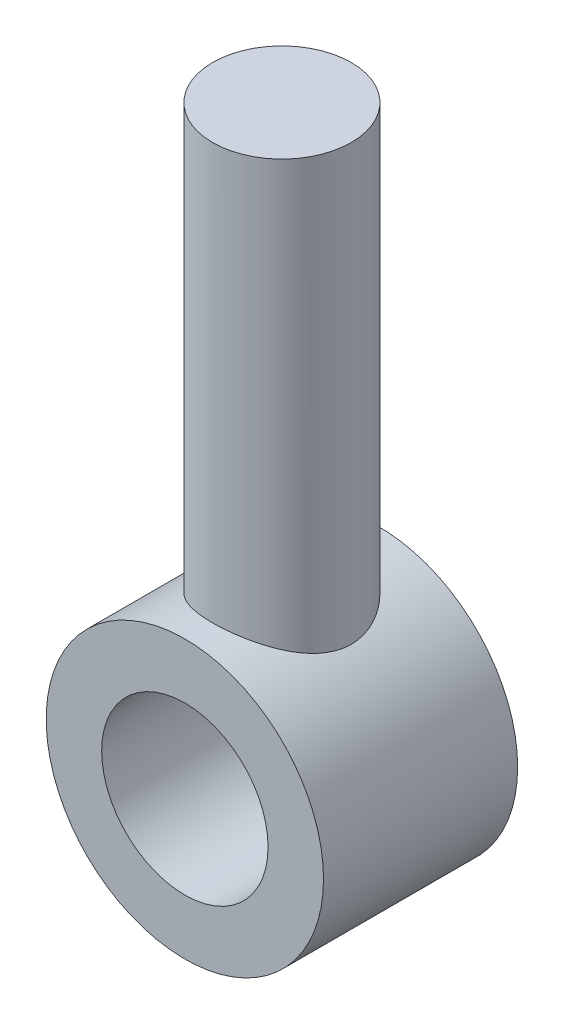
ISO-10303-21;
HEADER;
FILE_DESCRIPTION(('STEP AP214'),'2;1');
FILE_NAME('part.step','',(''),(''),'','','');
FILE_SCHEMA(('AUTOMOTIVE_DESIGN { 1 0 10303 214 1 1 1 1 }'));
ENDSEC;
DATA;
#1=APPLICATION_CONTEXT('core data for automotive mechanical design processes');
#2=APPLICATION_PROTOCOL_DEFINITION('international standard','automotive_design',2000,#1);
#3=PRODUCT_CONTEXT('',#1,'mechanical');
#4=PRODUCT('Part','Part','',(#3));
#5=PRODUCT_RELATED_PRODUCT_CATEGORY('part','',(#4));
#6=PRODUCT_DEFINITION_FORMATION('','',#4);
#7=PRODUCT_DEFINITION_CONTEXT('part definition',#1,'design');
#8=PRODUCT_DEFINITION('design','',#6,#7);
#9=PRODUCT_DEFINITION_SHAPE('','',#8);
#10=(LENGTH_UNIT() NAMED_UNIT(*) SI_UNIT(.MILLI.,.METRE.));
#11=(NAMED_UNIT(*) PLANE_ANGLE_UNIT() SI_UNIT($,.RADIAN.));
#12=(NAMED_UNIT(*) SI_UNIT($,.STERADIAN.) SOLID_ANGLE_UNIT());
#13=UNCERTAINTY_MEASURE_WITH_UNIT(LENGTH_MEASURE(1.E-05),#10,'distance_accuracy_value','');
#14=(GEOMETRIC_REPRESENTATION_CONTEXT(3) GLOBAL_UNCERTAINTY_ASSIGNED_CONTEXT((#13)) GLOBAL_UNIT_ASSIGNED_CONTEXT((#10,
#11,#12)) REPRESENTATION_CONTEXT('',''));
#15=CARTESIAN_POINT('',(0.,0.,0.));
#16=DIRECTION('',(0.,0.,1.));
#17=DIRECTION('',(1.,0.,0.));
#18=AXIS2_PLACEMENT_3D('',#15,#16,#17);
#19=CARTESIAN_POINT('',(0.,0.,7.));
#20=DIRECTION('',(0.,0.,-1.));
#21=DIRECTION('',(-1.,0.,0.));
#22=AXIS2_PLACEMENT_3D('',#19,#20,#21);
#23=CYLINDRICAL_SURFACE('',#22,5.);
#24=CARTESIAN_POINT('',(0.,0.,7.));
#25=DIRECTION('',(0.,0.,1.));
#26=DIRECTION('',(1.,0.,0.));
#27=AXIS2_PLACEMENT_3D('',#24,#25,#26);
#28=CIRCLE('',#27,5.);
#29=CARTESIAN_POINT('',(5.,0.,7.));
#30=VERTEX_POINT('',#29);
#31=EDGE_CURVE('E48',#30,#30,#28,.T.);
#32=ORIENTED_EDGE('',*,*,#31,.F.);
#33=EDGE_LOOP('',(#32));
#34=FACE_BOUND('',#33,.T.);
#35=CARTESIAN_POINT('',(0.,0.,0.));
#36=DIRECTION('',(0.,0.,1.));
#37=DIRECTION('',(1.,0.,0.));
#38=AXIS2_PLACEMENT_3D('',#35,#36,#37);
#39=CIRCLE('',#38,5.);
#40=CARTESIAN_POINT('',(5.,0.,0.));
#41=VERTEX_POINT('',#40);
#42=EDGE_CURVE('E44',#41,#41,#39,.T.);
#43=ORIENTED_EDGE('',*,*,#42,.T.);
#44=EDGE_LOOP('',(#43));
#45=FACE_BOUND('',#44,.T.);
#46=CARTESIAN_POINT('',(0.,5.,1.));
#47=CARTESIAN_POINT('',(-0.131426682334305,4.99999177550472,1.00000966905601));
#48=CARTESIAN_POINT('',(-0.263015634437212,4.99476199135277,1.01042556177403));
#49=CARTESIAN_POINT('',(-0.522301454622882,4.9743541856102,1.05163182116205));
#50=CARTESIAN_POINT('',(-0.649990448564105,4.9591572718767,1.08246088092502));
#51=CARTESIAN_POINT('',(-0.897333631316203,4.92040690922477,1.16298462271884));
#52=CARTESIAN_POINT('',(-1.01701694536277,4.89688595907259,1.21260598778273));
#53=CARTESIAN_POINT('',(-1.24618160399671,4.84364443325827,1.3289265262518));
#54=CARTESIAN_POINT('',(-1.3556637520377,4.81392434644421,1.39562435314509));
#55=CARTESIAN_POINT('',(-1.56876952630998,4.74890645050632,1.54879313164263));
#56=CARTESIAN_POINT('',(-1.67163802294308,4.71337997659091,1.63621620022978));
#57=CARTESIAN_POINT('',(-1.86194861703333,4.64149925776731,1.82630369598529));
#58=CARTESIAN_POINT('',(-1.94937895911555,4.60514440566897,1.92897962884011));
#59=CARTESIAN_POINT('',(-2.11312999967247,4.53247377945621,2.15620837444528));
#60=CARTESIAN_POINT('',(-2.18806333849064,4.49637967412567,2.28184024603501));
#61=CARTESIAN_POINT('',(-2.31542056761491,4.43214946943555,2.54591833979543));
#62=CARTESIAN_POINT('',(-2.36786053751682,4.40400769020792,2.68435532176262));
#63=CARTESIAN_POINT('',(-2.44533110537653,4.36144667591402,2.96166276359641));
#64=CARTESIAN_POINT('',(-2.47181464267578,4.34630678958452,3.10001113017958));
#65=CARTESIAN_POINT('',(-2.50106748329741,4.3295472487215,3.37994709443761));
#66=CARTESIAN_POINT('',(-2.50386022093906,4.3279142335843,3.52153135217509));
#67=CARTESIAN_POINT('',(-2.48671821792512,4.33777325642937,3.78571506079088));
#68=CARTESIAN_POINT('',(-2.46946139884055,4.34771909154984,3.90856007805828));
#69=CARTESIAN_POINT('',(-2.41734962264384,4.37690571834675,4.14930477343195));
#70=CARTESIAN_POINT('',(-2.38248905974454,4.39614947079454,4.26720286326311));
#71=CARTESIAN_POINT('',(-2.29552445096459,4.44218691031839,4.49807283141433));
#72=CARTESIAN_POINT('',(-2.24303766778987,4.46914601659992,4.61086599696452));
#73=CARTESIAN_POINT('',(-2.12260421917012,4.52758510703513,4.82658573147497));
#74=CARTESIAN_POINT('',(-2.0546506095312,4.55906711950477,4.92950783900021));
#75=CARTESIAN_POINT('',(-1.89516513728194,4.62782894758213,5.13630313185808));
#76=CARTESIAN_POINT('',(-1.8017361459232,4.66533775591865,5.2386421839404));
#77=CARTESIAN_POINT('',(-1.59888894685344,4.73869058251019,5.42683854647725));
#78=CARTESIAN_POINT('',(-1.48946314143571,4.77453379897003,5.5126879800847));
#79=CARTESIAN_POINT('',(-1.25129126457962,4.84254968207409,5.66921415257432));
#80=CARTESIAN_POINT('',(-1.12188397899853,4.87447460405015,5.73900118111435));
#81=CARTESIAN_POINT('',(-0.851165538721987,4.92894702803108,5.85524257260752));
#82=CARTESIAN_POINT('',(-0.709863940663164,4.95150197358893,5.9017154625379));
#83=CARTESIAN_POINT('',(-0.431916229151782,4.98310834353579,5.9661885092917));
#84=CARTESIAN_POINT('',(-0.295853826370908,4.9931234575324,5.986228089367));
#85=CARTESIAN_POINT('',(-0.0219489998732899,5.00182533647794,6.00366182783617));
#86=CARTESIAN_POINT('',(0.115892549675108,5.00051746803426,6.0010667140985));
#87=CARTESIAN_POINT('',(0.378082429964655,4.98727980633468,5.9744832789533));
#88=CARTESIAN_POINT('',(0.502648520123705,4.97618114219992,5.9521686681756));
#89=CARTESIAN_POINT('',(0.746017230755971,4.94555428287529,5.88940482026162));
#90=CARTESIAN_POINT('',(0.864819214231882,4.92602515837625,5.84895358386411));
#91=CARTESIAN_POINT('',(1.09722152111965,4.87960628532329,5.75000383391964));
#92=CARTESIAN_POINT('',(1.21057599249831,4.85252204417873,5.69102237471768));
#93=CARTESIAN_POINT('',(1.42615340426439,4.7935993579975,5.55723116087518));
#94=CARTESIAN_POINT('',(1.52837157450203,4.76175888940534,5.48241466348012));
#95=CARTESIAN_POINT('',(1.72941922315487,4.69270553315086,5.31059893670911));
#96=CARTESIAN_POINT('',(1.82693019428496,4.65527212009488,5.2121428290248));
#97=CARTESIAN_POINT('',(2.0046408025722,4.58155978921587,5.00018712195056));
#98=CARTESIAN_POINT('',(2.08482846428685,4.54528168472407,4.88667720293014));
#99=CARTESIAN_POINT('',(2.22926978618995,4.4762798054528,4.64089086451535));
#100=CARTESIAN_POINT('',(2.29256373922243,4.44381323981254,4.50797183470886));
#101=CARTESIAN_POINT('',(2.39520706511459,4.38935180726746,4.23122483111745));
#102=CARTESIAN_POINT('',(2.43458729077055,4.36734345549014,4.08741118400001));
#103=CARTESIAN_POINT('',(2.48465421767005,4.33903752569351,3.80772444263706));
#104=CARTESIAN_POINT('',(2.4977324874436,4.33143458674096,3.67241436588103));
#105=CARTESIAN_POINT('',(2.50172288950898,4.32913386592579,3.40138233261932));
#106=CARTESIAN_POINT('',(2.49264462983266,4.3344304902511,3.26566058012637));
#107=CARTESIAN_POINT('',(2.45481530197332,4.35594655164663,3.01129124438315));
#108=CARTESIAN_POINT('',(2.42802074302696,4.37107736338133,2.89224881827923));
#109=CARTESIAN_POINT('',(2.35793843840543,4.40927540337602,2.66047970780004));
#110=CARTESIAN_POINT('',(2.31464538728732,4.43234518434965,2.54775506843346));
#111=CARTESIAN_POINT('',(2.20953919315538,4.48571326433413,2.32343784728027));
#112=CARTESIAN_POINT('',(2.14667719009403,4.5163930799845,2.21243014826498));
#113=CARTESIAN_POINT('',(2.0053780838799,4.58088327077455,2.00181375675995));
#114=CARTESIAN_POINT('',(1.92693287765888,4.61469526970767,1.90221103737127));
#115=CARTESIAN_POINT('',(1.74550556946065,4.68655816327011,1.70464463625036));
#116=CARTESIAN_POINT('',(1.6407002246921,4.7246249151498,1.60835063582863));
#117=CARTESIAN_POINT('',(1.41539785420684,4.79694347383545,1.43434415057196));
#118=CARTESIAN_POINT('',(1.29489242426332,4.83119321905446,1.35664168139412));
#119=CARTESIAN_POINT('',(1.03978808878536,4.89245149457782,1.2219030205159));
#120=CARTESIAN_POINT('',(0.905095560782288,4.91940711437488,1.16501683221555));
#121=CARTESIAN_POINT('',(0.696328709257351,4.9517796092335,1.0978161412076));
#122=CARTESIAN_POINT('',(0.625670413494088,4.96122314081874,1.07844460199819));
#123=CARTESIAN_POINT('',(0.482623997839257,4.97717127275101,1.0459340516294));
#124=CARTESIAN_POINT('',(0.410236963092401,4.98367766823159,1.03279123332365));
#125=CARTESIAN_POINT('',(0.281518684621671,4.9923820076613,1.01526252771537));
#126=CARTESIAN_POINT('',(0.225408499555444,4.99523288466454,1.00954506346868));
#127=CARTESIAN_POINT('',(0.112875528456289,4.99904367329658,1.00191167053429));
#128=CARTESIAN_POINT('',(0.0564527338382179,5.00000353273198,0.999995846774524));
#129=CARTESIAN_POINT('',(0.,5.,1.));
#130=B_SPLINE_CURVE_WITH_KNOTS('',3,(#46,#47,#48,#49,#50,#51,#52,#53,#54,#55,#56,#57,#58,#59,
#60,#61,#62,#63,#64,#65,#66,#67,#68,#69,#70,#71,#72,#73,#74,#75,#76,#77,#78,#79,#80,#81,#82,#83,
#84,#85,#86,#87,#88,#89,#90,#91,#92,#93,#94,#95,#96,#97,#98,#99,#100,#101,#102,#103,#104,#105,
#106,#107,#108,#109,#110,#111,#112,#113,#114,#115,#116,#117,#118,#119,#120,#121,#122,#123,#124,
#125,#126,#127,#128,#129),.UNSPECIFIED.,.T.,.F.,(4,2,2,2,2,2,2,2,2,2,2,2,2,2,2,2,2,2,2,2,2,2,2,
2,2,2,2,2,2,2,2,2,2,2,2,2,2,2,2,2,2,4),(0.,0.394060643550731,0.788870374272994,1.18215538873075,
1.57540940145392,1.99245439679522,2.40981559413509,2.85954316076882,3.30894869745702,
3.73145030350574,4.15353393322551,4.52514281023301,4.89687009814196,5.27725600421218,
5.65781303150554,6.08662353334696,6.51563836496716,6.96457555536101,7.41315542280699,
7.82458226178364,8.2358141127869,8.61517266265305,8.99457304077329,9.38482140069747,
9.77523626870848,10.2039902661037,10.6330397153795,11.0828670540368,11.53211279863,
11.9382326875699,12.3441764966106,12.7114482562151,13.0788382197025,13.4709114195009,
13.8631890285845,14.303131068923,14.7433095845248,15.1866003415819,15.407934939208,
15.6291340766843,15.7983933645035,15.9676573239323),.UNSPECIFIED.);
#131=CARTESIAN_POINT('',(0.,5.,1.));
#132=VERTEX_POINT('',#131);
#133=EDGE_CURVE('E10',#132,#132,#130,.T.);
#134=ORIENTED_EDGE('',*,*,#133,.F.);
#135=EDGE_LOOP('',(#134));
#136=FACE_BOUND('',#135,.T.);
#137=ADVANCED_FACE('F40',(#34,#45,#136),#23,.T.);
#138=CARTESIAN_POINT('',(0.,0.,7.));
#139=DIRECTION('',(0.,0.,1.));
#140=DIRECTION('',(1.,0.,0.));
#141=AXIS2_PLACEMENT_3D('',#138,#139,#140);
#142=PLANE('',#141);
#143=ORIENTED_EDGE('',*,*,#31,.T.);
#144=EDGE_LOOP('',(#143));
#145=FACE_BOUND('',#144,.T.);
#146=CARTESIAN_POINT('',(0.,0.,7.));
#147=DIRECTION('',(0.,0.,1.));
#148=DIRECTION('',(1.,0.,0.));
#149=AXIS2_PLACEMENT_3D('',#146,#147,#148);
#150=CIRCLE('',#149,3.);
#151=CARTESIAN_POINT('',(3.,0.,7.));
#152=VERTEX_POINT('',#151);
#153=EDGE_CURVE('E60',#152,#152,#150,.T.);
#154=ORIENTED_EDGE('',*,*,#153,.F.);
#155=EDGE_LOOP('',(#154));
#156=FACE_BOUND('',#155,.T.);
#157=ADVANCED_FACE('F74',(#145,#156),#142,.T.);
#158=CARTESIAN_POINT('',(0.,0.,0.));
#159=DIRECTION('',(0.,0.,1.));
#160=DIRECTION('',(1.,0.,0.));
#161=AXIS2_PLACEMENT_3D('',#158,#159,#160);
#162=PLANE('',#161);
#163=ORIENTED_EDGE('',*,*,#42,.F.);
#164=EDGE_LOOP('',(#163));
#165=FACE_BOUND('',#164,.T.);
#166=CARTESIAN_POINT('',(0.,0.,0.));
#167=DIRECTION('',(0.,0.,1.));
#168=DIRECTION('',(1.,0.,0.));
#169=AXIS2_PLACEMENT_3D('',#166,#167,#168);
#170=CIRCLE('',#169,3.);
#171=CARTESIAN_POINT('',(3.,0.,0.));
#172=VERTEX_POINT('',#171);
#173=EDGE_CURVE('E92',#172,#172,#170,.T.);
#174=ORIENTED_EDGE('',*,*,#173,.T.);
#175=EDGE_LOOP('',(#174));
#176=FACE_BOUND('',#175,.T.);
#177=ADVANCED_FACE('F72',(#165,#176),#162,.F.);
#178=CARTESIAN_POINT('',(0.,0.,7.));
#179=DIRECTION('',(0.,0.,-1.));
#180=DIRECTION('',(-1.,0.,0.));
#181=AXIS2_PLACEMENT_3D('',#178,#179,#180);
#182=CYLINDRICAL_SURFACE('',#181,3.);
#183=ORIENTED_EDGE('',*,*,#153,.T.);
#184=EDGE_LOOP('',(#183));
#185=FACE_BOUND('',#184,.T.);
#186=ORIENTED_EDGE('',*,*,#173,.F.);
#187=EDGE_LOOP('',(#186));
#188=FACE_BOUND('',#187,.T.);
#189=ADVANCED_FACE('F68',(#185,#188),#182,.F.);
#190=CARTESIAN_POINT('',(0.,20.,3.5));
#191=DIRECTION('',(0.,-1.,0.));
#192=DIRECTION('',(0.,0.,-1.));
#193=AXIS2_PLACEMENT_3D('',#190,#191,#192);
#194=CYLINDRICAL_SURFACE('',#193,2.5);
#195=CARTESIAN_POINT('',(0.,20.,3.5));
#196=DIRECTION('',(0.,1.,0.));
#197=DIRECTION('',(0.,0.,1.));
#198=AXIS2_PLACEMENT_3D('',#195,#196,#197);
#199=CIRCLE('',#198,2.5);
#200=CARTESIAN_POINT('',(0.,20.,6.));
#201=VERTEX_POINT('',#200);
#202=EDGE_CURVE('E59',#201,#201,#199,.T.);
#203=ORIENTED_EDGE('',*,*,#202,.F.);
#204=EDGE_LOOP('',(#203));
#205=FACE_BOUND('',#204,.T.);
#206=ORIENTED_EDGE('',*,*,#133,.T.);
#207=EDGE_LOOP('',(#206));
#208=FACE_BOUND('',#207,.T.);
#209=ADVANCED_FACE('F62',(#205,#208),#194,.T.);
#210=CARTESIAN_POINT('',(0.,20.,3.5));
#211=DIRECTION('',(0.,1.,0.));
#212=DIRECTION('',(0.,0.,1.));
#213=AXIS2_PLACEMENT_3D('',#210,#211,#212);
#214=PLANE('',#213);
#215=ORIENTED_EDGE('',*,*,#202,.T.);
#216=EDGE_LOOP('',(#215));
#217=FACE_BOUND('',#216,.T.);
#218=ADVANCED_FACE('F67',(#217),#214,.T.);
#219=CLOSED_SHELL('',(#137,#157,#177,#189,#209,#218));
#220=MANIFOLD_SOLID_BREP('B2',#219);
#221=ADVANCED_BREP_SHAPE_REPRESENTATION('',(#18,#220),#14);
#222=SHAPE_DEFINITION_REPRESENTATION(#9,#221);
ENDSEC;
END-ISO-10303-21;
